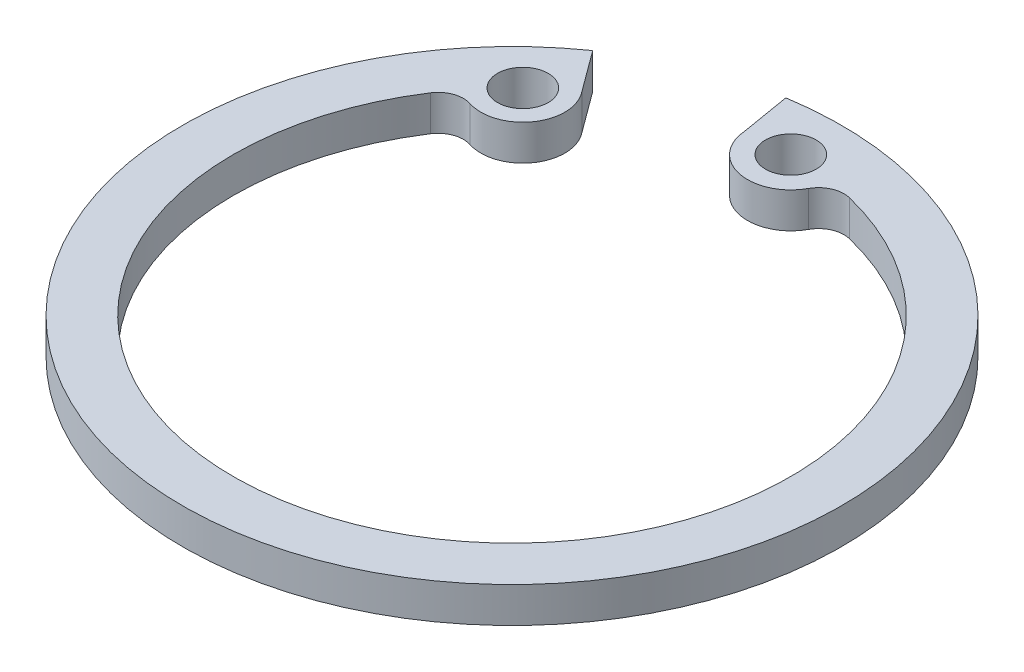
ISO-10303-21;
HEADER;
FILE_DESCRIPTION(('STEP AP214'),'2;1');
FILE_NAME('part.step','',(''),(''),'','','');
FILE_SCHEMA(('AUTOMOTIVE_DESIGN { 1 0 10303 214 1 1 1 1 }'));
ENDSEC;
DATA;
#1=APPLICATION_CONTEXT('core data for automotive mechanical design processes');
#2=APPLICATION_PROTOCOL_DEFINITION('international standard','automotive_design',2000,#1);
#3=PRODUCT_CONTEXT('',#1,'mechanical');
#4=PRODUCT('Part','Part','',(#3));
#5=PRODUCT_RELATED_PRODUCT_CATEGORY('part','',(#4));
#6=PRODUCT_DEFINITION_FORMATION('','',#4);
#7=PRODUCT_DEFINITION_CONTEXT('part definition',#1,'design');
#8=PRODUCT_DEFINITION('design','',#6,#7);
#9=PRODUCT_DEFINITION_SHAPE('','',#8);
#10=(LENGTH_UNIT() NAMED_UNIT(*) SI_UNIT(.MILLI.,.METRE.));
#11=(NAMED_UNIT(*) PLANE_ANGLE_UNIT() SI_UNIT($,.RADIAN.));
#12=(NAMED_UNIT(*) SI_UNIT($,.STERADIAN.) SOLID_ANGLE_UNIT());
#13=UNCERTAINTY_MEASURE_WITH_UNIT(LENGTH_MEASURE(1.E-05),#10,'distance_accuracy_value','');
#14=(GEOMETRIC_REPRESENTATION_CONTEXT(3) GLOBAL_UNCERTAINTY_ASSIGNED_CONTEXT((#13)) GLOBAL_UNIT_ASSIGNED_CONTEXT((#10,
#11,#12)) REPRESENTATION_CONTEXT('',''));
#15=CARTESIAN_POINT('',(0.,0.,0.));
#16=DIRECTION('',(0.,0.,1.));
#17=DIRECTION('',(1.,0.,0.));
#18=AXIS2_PLACEMENT_3D('',#15,#16,#17);
#19=CARTESIAN_POINT('',(-7.56112480942902,1.4,-7.9893298602722));
#20=DIRECTION('',(0.,1.,0.));
#21=DIRECTION('',(0.,0.,1.));
#22=AXIS2_PLACEMENT_3D('',#19,#20,#21);
#23=PLANE('',#22);
#24=CARTESIAN_POINT('',(0.,1.4,-11.));
#25=DIRECTION('',(0.,1.,0.));
#26=DIRECTION('',(0.,0.,1.));
#27=AXIS2_PLACEMENT_3D('',#24,#25,#26);
#28=CIRCLE('',#27,1.);
#29=CARTESIAN_POINT('',(0.,1.4,-10.));
#30=VERTEX_POINT('',#29);
#31=EDGE_CURVE('E133',#30,#30,#28,.T.);
#32=ORIENTED_EDGE('',*,*,#31,.F.);
#33=EDGE_LOOP('',(#32));
#34=FACE_BOUND('',#33,.T.);
#35=CARTESIAN_POINT('',(-7.56112480942902,1.4,-7.9893298602722));
#36=DIRECTION('',(0.,1.,0.));
#37=DIRECTION('',(0.,0.,1.));
#38=AXIS2_PLACEMENT_3D('',#35,#36,#37);
#39=CIRCLE('',#38,1.65691523834354);
#40=CARTESIAN_POINT('',(-8.0700995983329,1.4,-6.41252525242908));
#41=VERTEX_POINT('',#40);
#42=CARTESIAN_POINT('',(-6.27534352941445,1.4,-9.03438230250614));
#43=VERTEX_POINT('',#42);
#44=EDGE_CURVE('E144',#41,#43,#39,.T.);
#45=ORIENTED_EDGE('',*,*,#44,.T.);
#46=DIRECTION('',(-0.592679866235724,0.,-0.805438126834585));
#47=VECTOR('',#46,1.);
#48=CARTESIAN_POINT('',(-6.27534352941445,1.4,-9.03438230250614));
#49=LINE('',#48,#47);
#50=CARTESIAN_POINT('',(-7.4610766928894,1.4,-10.6457660402069));
#51=VERTEX_POINT('',#50);
#52=EDGE_CURVE('E92',#43,#51,#49,.T.);
#53=ORIENTED_EDGE('',*,*,#52,.T.);
#54=CARTESIAN_POINT('',(0.,1.4,0.));
#55=DIRECTION('',(0.,1.,0.));
#56=DIRECTION('',(0.,0.,1.));
#57=AXIS2_PLACEMENT_3D('',#54,#55,#56);
#58=CIRCLE('',#57,13.);
#59=CARTESIAN_POINT('',(-2.03684759198076,1.4,-12.839441260703));
#60=VERTEX_POINT('',#59);
#61=EDGE_CURVE('E159',#51,#60,#58,.T.);
#62=ORIENTED_EDGE('',*,*,#61,.T.);
#63=DIRECTION('',(0.166071808847117,0.,0.986113661961057));
#64=VECTOR('',#63,1.);
#65=CARTESIAN_POINT('',(-1.70468620063874,1.4,-10.8671083990799));
#66=LINE('',#65,#64);
#67=CARTESIAN_POINT('',(-1.70468620063874,1.4,-10.8671083990799));
#68=VERTEX_POINT('',#67);
#69=EDGE_CURVE('E172',#60,#68,#66,.T.);
#70=ORIENTED_EDGE('',*,*,#69,.T.);
#71=CARTESIAN_POINT('',(0.,1.4,-11.));
#72=DIRECTION('',(0.,1.,0.));
#73=DIRECTION('',(0.,0.,1.));
#74=AXIS2_PLACEMENT_3D('',#71,#72,#73);
#75=CIRCLE('',#74,1.70985824565759);
#76=CARTESIAN_POINT('',(1.50425886191016,1.4,-10.1870913356299));
#77=VERTEX_POINT('',#76);
#78=EDGE_CURVE('E111',#68,#77,#75,.T.);
#79=ORIENTED_EDGE('',*,*,#78,.T.);
#80=CARTESIAN_POINT('',(2.38401533630236,1.4,-9.71166674038371));
#81=DIRECTION('',(0.,-1.,0.));
#82=DIRECTION('',(0.,0.,1.));
#83=AXIS2_PLACEMENT_3D('',#80,#81,#82);
#84=CIRCLE('',#83,1.);
#85=CARTESIAN_POINT('',(2.6224168699326,1.4,-10.6828334144221));
#86=VERTEX_POINT('',#85);
#87=EDGE_CURVE('E105',#77,#86,#84,.T.);
#88=ORIENTED_EDGE('',*,*,#87,.T.);
#89=CARTESIAN_POINT('',(0.,1.4,0.));
#90=DIRECTION('',(0.,-1.,0.));
#91=DIRECTION('',(0.,0.,1.));
#92=AXIS2_PLACEMENT_3D('',#89,#90,#91);
#93=CIRCLE('',#92,11.);
#94=CARTESIAN_POINT('',(-9.2150099255706,1.4,-6.00696196688769));
#95=VERTEX_POINT('',#94);
#96=EDGE_CURVE('E109',#86,#95,#93,.T.);
#97=ORIENTED_EDGE('',*,*,#96,.T.);
#98=CARTESIAN_POINT('',(-8.37728175051873,1.4,-5.46087451535245));
#99=DIRECTION('',(0.,-1.,0.));
#100=DIRECTION('',(0.,0.,1.));
#101=AXIS2_PLACEMENT_3D('',#98,#99,#100);
#102=CIRCLE('',#101,1.);
#103=EDGE_CURVE('E49',#95,#41,#102,.T.);
#104=ORIENTED_EDGE('',*,*,#103,.T.);
#105=EDGE_LOOP('',(#45,#53,#62,#70,#79,#88,#97,#104));
#106=FACE_BOUND('',#105,.T.);
#107=CARTESIAN_POINT('',(-7.56112480942902,1.4,-7.9893298602722));
#108=DIRECTION('',(0.,1.,0.));
#109=DIRECTION('',(0.,0.,1.));
#110=AXIS2_PLACEMENT_3D('',#107,#108,#109);
#111=CIRCLE('',#110,1.);
#112=CARTESIAN_POINT('',(-7.56112480942902,1.4,-6.9893298602722));
#113=VERTEX_POINT('',#112);
#114=EDGE_CURVE('E181',#113,#113,#111,.T.);
#115=ORIENTED_EDGE('',*,*,#114,.F.);
#116=EDGE_LOOP('',(#115));
#117=FACE_BOUND('',#116,.T.);
#118=ADVANCED_FACE('F32',(#34,#106,#117),#23,.T.);
#119=CARTESIAN_POINT('',(-7.56112480942902,0.,-7.9893298602722));
#120=DIRECTION('',(0.,1.,0.));
#121=DIRECTION('',(0.,0.,1.));
#122=AXIS2_PLACEMENT_3D('',#119,#120,#121);
#123=PLANE('',#122);
#124=CARTESIAN_POINT('',(0.,0.,-11.));
#125=DIRECTION('',(0.,1.,0.));
#126=DIRECTION('',(0.,0.,1.));
#127=AXIS2_PLACEMENT_3D('',#124,#125,#126);
#128=CIRCLE('',#127,1.);
#129=CARTESIAN_POINT('',(0.,0.,-10.));
#130=VERTEX_POINT('',#129);
#131=EDGE_CURVE('E178',#130,#130,#128,.T.);
#132=ORIENTED_EDGE('',*,*,#131,.T.);
#133=EDGE_LOOP('',(#132));
#134=FACE_BOUND('',#133,.T.);
#135=CARTESIAN_POINT('',(-7.56112480942902,0.,-7.9893298602722));
#136=DIRECTION('',(0.,1.,0.));
#137=DIRECTION('',(0.,0.,1.));
#138=AXIS2_PLACEMENT_3D('',#135,#136,#137);
#139=CIRCLE('',#138,1.65691523834354);
#140=CARTESIAN_POINT('',(-8.0700995983329,0.,-6.41252525242908));
#141=VERTEX_POINT('',#140);
#142=CARTESIAN_POINT('',(-6.27534352941445,0.,-9.03438230250614));
#143=VERTEX_POINT('',#142);
#144=EDGE_CURVE('E129',#141,#143,#139,.T.);
#145=ORIENTED_EDGE('',*,*,#144,.F.);
#146=CARTESIAN_POINT('',(-8.37728175051873,0.,-5.46087451535245));
#147=DIRECTION('',(0.,-1.,0.));
#148=DIRECTION('',(0.,0.,1.));
#149=AXIS2_PLACEMENT_3D('',#146,#147,#148);
#150=CIRCLE('',#149,1.);
#151=CARTESIAN_POINT('',(-9.2150099255706,0.,-6.00696196688769));
#152=VERTEX_POINT('',#151);
#153=EDGE_CURVE('E84',#152,#141,#150,.T.);
#154=ORIENTED_EDGE('',*,*,#153,.F.);
#155=CARTESIAN_POINT('',(0.,0.,0.));
#156=DIRECTION('',(0.,-1.,0.));
#157=DIRECTION('',(0.,0.,1.));
#158=AXIS2_PLACEMENT_3D('',#155,#156,#157);
#159=CIRCLE('',#158,11.);
#160=CARTESIAN_POINT('',(2.6224168699326,0.,-10.6828334144221));
#161=VERTEX_POINT('',#160);
#162=EDGE_CURVE('E78',#161,#152,#159,.T.);
#163=ORIENTED_EDGE('',*,*,#162,.F.);
#164=CARTESIAN_POINT('',(2.38401533630236,0.,-9.71166674038371));
#165=DIRECTION('',(0.,-1.,0.));
#166=DIRECTION('',(0.,0.,1.));
#167=AXIS2_PLACEMENT_3D('',#164,#165,#166);
#168=CIRCLE('',#167,1.);
#169=CARTESIAN_POINT('',(1.50425886191016,0.,-10.1870913356299));
#170=VERTEX_POINT('',#169);
#171=EDGE_CURVE('E119',#170,#161,#168,.T.);
#172=ORIENTED_EDGE('',*,*,#171,.F.);
#173=CARTESIAN_POINT('',(0.,0.,-11.));
#174=DIRECTION('',(0.,1.,0.));
#175=DIRECTION('',(0.,0.,1.));
#176=AXIS2_PLACEMENT_3D('',#173,#174,#175);
#177=CIRCLE('',#176,1.70985824565759);
#178=CARTESIAN_POINT('',(-1.70468620063874,0.,-10.8671083990799));
#179=VERTEX_POINT('',#178);
#180=EDGE_CURVE('E139',#179,#170,#177,.T.);
#181=ORIENTED_EDGE('',*,*,#180,.F.);
#182=DIRECTION('',(0.166071808847117,0.,0.986113661961057));
#183=VECTOR('',#182,1.);
#184=CARTESIAN_POINT('',(-1.70468620063874,0.,-10.8671083990799));
#185=LINE('',#184,#183);
#186=CARTESIAN_POINT('',(-2.03684759198076,0.,-12.839441260703));
#187=VERTEX_POINT('',#186);
#188=EDGE_CURVE('E137',#187,#179,#185,.T.);
#189=ORIENTED_EDGE('',*,*,#188,.F.);
#190=CARTESIAN_POINT('',(0.,0.,0.));
#191=DIRECTION('',(0.,1.,0.));
#192=DIRECTION('',(0.,0.,1.));
#193=AXIS2_PLACEMENT_3D('',#190,#191,#192);
#194=CIRCLE('',#193,13.);
#195=CARTESIAN_POINT('',(-7.4610766928894,0.,-10.6457660402069));
#196=VERTEX_POINT('',#195);
#197=EDGE_CURVE('E135',#196,#187,#194,.T.);
#198=ORIENTED_EDGE('',*,*,#197,.F.);
#199=DIRECTION('',(-0.592679866235724,0.,-0.805438126834585));
#200=VECTOR('',#199,1.);
#201=CARTESIAN_POINT('',(-6.27534352941445,0.,-9.03438230250614));
#202=LINE('',#201,#200);
#203=EDGE_CURVE('E132',#143,#196,#202,.T.);
#204=ORIENTED_EDGE('',*,*,#203,.F.);
#205=EDGE_LOOP('',(#145,#154,#163,#172,#181,#189,#198,#204));
#206=FACE_BOUND('',#205,.T.);
#207=CARTESIAN_POINT('',(-7.56112480942902,0.,-7.9893298602722));
#208=DIRECTION('',(0.,1.,0.));
#209=DIRECTION('',(0.,0.,1.));
#210=AXIS2_PLACEMENT_3D('',#207,#208,#209);
#211=CIRCLE('',#210,1.);
#212=CARTESIAN_POINT('',(-7.56112480942902,0.,-6.9893298602722));
#213=VERTEX_POINT('',#212);
#214=EDGE_CURVE('E184',#213,#213,#211,.T.);
#215=ORIENTED_EDGE('',*,*,#214,.T.);
#216=EDGE_LOOP('',(#215));
#217=FACE_BOUND('',#216,.T.);
#218=ADVANCED_FACE('F163',(#134,#206,#217),#123,.F.);
#219=CARTESIAN_POINT('',(-7.56112480942902,1.4,-7.9893298602722));
#220=DIRECTION('',(0.,-1.,0.));
#221=DIRECTION('',(0.,0.,-1.));
#222=AXIS2_PLACEMENT_3D('',#219,#220,#221);
#223=CYLINDRICAL_SURFACE('',#222,1.65691523834354);
#224=ORIENTED_EDGE('',*,*,#144,.T.);
#225=DIRECTION('',(0.,-1.,0.));
#226=VECTOR('',#225,1.);
#227=CARTESIAN_POINT('',(-6.27534352941445,1.4,-9.03438230250614));
#228=LINE('',#227,#226);
#229=EDGE_CURVE('E11',#43,#143,#228,.T.);
#230=ORIENTED_EDGE('',*,*,#229,.F.);
#231=ORIENTED_EDGE('',*,*,#44,.F.);
#232=DIRECTION('',(0.,-1.,0.));
#233=VECTOR('',#232,1.);
#234=CARTESIAN_POINT('',(-8.0700995983329,1.4,-6.41252525242908));
#235=LINE('',#234,#233);
#236=EDGE_CURVE('E125',#41,#141,#235,.T.);
#237=ORIENTED_EDGE('',*,*,#236,.T.);
#238=EDGE_LOOP('',(#224,#230,#231,#237));
#239=FACE_BOUND('',#238,.T.);
#240=ADVANCED_FACE('F34',(#239),#223,.T.);
#241=CARTESIAN_POINT('',(-6.27534352941445,1.4,-9.03438230250614));
#242=DIRECTION('',(-0.805438126834585,0.,0.592679866235724));
#243=DIRECTION('',(0.592679866235724,0.,0.805438126834585));
#244=AXIS2_PLACEMENT_3D('',#241,#242,#243);
#245=PLANE('',#244);
#246=ORIENTED_EDGE('',*,*,#203,.T.);
#247=DIRECTION('',(0.,-1.,0.));
#248=VECTOR('',#247,1.);
#249=CARTESIAN_POINT('',(-7.4610766928894,1.4,-10.6457660402069));
#250=LINE('',#249,#248);
#251=EDGE_CURVE('E41',#51,#196,#250,.T.);
#252=ORIENTED_EDGE('',*,*,#251,.F.);
#253=ORIENTED_EDGE('',*,*,#52,.F.);
#254=ORIENTED_EDGE('',*,*,#229,.T.);
#255=EDGE_LOOP('',(#246,#252,#253,#254));
#256=FACE_BOUND('',#255,.T.);
#257=ADVANCED_FACE('F217',(#256),#245,.F.);
#258=CARTESIAN_POINT('',(0.,1.4,0.));
#259=DIRECTION('',(0.,-1.,0.));
#260=DIRECTION('',(0.,0.,-1.));
#261=AXIS2_PLACEMENT_3D('',#258,#259,#260);
#262=CYLINDRICAL_SURFACE('',#261,13.);
#263=ORIENTED_EDGE('',*,*,#197,.T.);
#264=DIRECTION('',(0.,-1.,0.));
#265=VECTOR('',#264,1.);
#266=CARTESIAN_POINT('',(-2.03684759198076,1.4,-12.839441260703));
#267=LINE('',#266,#265);
#268=EDGE_CURVE('E151',#60,#187,#267,.T.);
#269=ORIENTED_EDGE('',*,*,#268,.F.);
#270=ORIENTED_EDGE('',*,*,#61,.F.);
#271=ORIENTED_EDGE('',*,*,#251,.T.);
#272=EDGE_LOOP('',(#263,#269,#270,#271));
#273=FACE_BOUND('',#272,.T.);
#274=ADVANCED_FACE('F157',(#273),#262,.T.);
#275=CARTESIAN_POINT('',(-1.70468620063874,1.4,-10.8671083990799));
#276=DIRECTION('',(0.986113661961057,0.,-0.166071808847117));
#277=DIRECTION('',(-0.166071808847117,0.,-0.986113661961057));
#278=AXIS2_PLACEMENT_3D('',#275,#276,#277);
#279=PLANE('',#278);
#280=ORIENTED_EDGE('',*,*,#188,.T.);
#281=DIRECTION('',(0.,-1.,0.));
#282=VECTOR('',#281,1.);
#283=CARTESIAN_POINT('',(-1.70468620063874,1.4,-10.8671083990799));
#284=LINE('',#283,#282);
#285=EDGE_CURVE('E148',#68,#179,#284,.T.);
#286=ORIENTED_EDGE('',*,*,#285,.F.);
#287=ORIENTED_EDGE('',*,*,#69,.F.);
#288=ORIENTED_EDGE('',*,*,#268,.T.);
#289=EDGE_LOOP('',(#280,#286,#287,#288));
#290=FACE_BOUND('',#289,.T.);
#291=ADVANCED_FACE('F168',(#290),#279,.F.);
#292=CARTESIAN_POINT('',(0.,1.4,-11.));
#293=DIRECTION('',(0.,-1.,0.));
#294=DIRECTION('',(0.,0.,-1.));
#295=AXIS2_PLACEMENT_3D('',#292,#293,#294);
#296=CYLINDRICAL_SURFACE('',#295,1.70985824565759);
#297=ORIENTED_EDGE('',*,*,#180,.T.);
#298=DIRECTION('',(0.,-1.,0.));
#299=VECTOR('',#298,1.);
#300=CARTESIAN_POINT('',(1.50425886191016,1.4,-10.1870913356299));
#301=LINE('',#300,#299);
#302=EDGE_CURVE('E120',#77,#170,#301,.T.);
#303=ORIENTED_EDGE('',*,*,#302,.F.);
#304=ORIENTED_EDGE('',*,*,#78,.F.);
#305=ORIENTED_EDGE('',*,*,#285,.T.);
#306=EDGE_LOOP('',(#297,#303,#304,#305));
#307=FACE_BOUND('',#306,.T.);
#308=ADVANCED_FACE('F171',(#307),#296,.T.);
#309=CARTESIAN_POINT('',(2.38401533630236,1.4,-9.71166674038371));
#310=DIRECTION('',(0.,-1.,0.));
#311=DIRECTION('',(0.,0.,-1.));
#312=AXIS2_PLACEMENT_3D('',#309,#310,#311);
#313=CYLINDRICAL_SURFACE('',#312,1.);
#314=ORIENTED_EDGE('',*,*,#171,.T.);
#315=DIRECTION('',(0.,-1.,0.));
#316=VECTOR('',#315,1.);
#317=CARTESIAN_POINT('',(2.6224168699326,1.4,-10.6828334144221));
#318=LINE('',#317,#316);
#319=EDGE_CURVE('E116',#86,#161,#318,.T.);
#320=ORIENTED_EDGE('',*,*,#319,.F.);
#321=ORIENTED_EDGE('',*,*,#87,.F.);
#322=ORIENTED_EDGE('',*,*,#302,.T.);
#323=EDGE_LOOP('',(#314,#320,#321,#322));
#324=FACE_BOUND('',#323,.T.);
#325=ADVANCED_FACE('F117',(#324),#313,.F.);
#326=CARTESIAN_POINT('',(0.,1.4,0.));
#327=DIRECTION('',(0.,-1.,0.));
#328=DIRECTION('',(0.,0.,-1.));
#329=AXIS2_PLACEMENT_3D('',#326,#327,#328);
#330=CYLINDRICAL_SURFACE('',#329,11.);
#331=ORIENTED_EDGE('',*,*,#162,.T.);
#332=DIRECTION('',(0.,-1.,0.));
#333=VECTOR('',#332,1.);
#334=CARTESIAN_POINT('',(-9.2150099255706,1.4,-6.00696196688769));
#335=LINE('',#334,#333);
#336=EDGE_CURVE('E121',#95,#152,#335,.T.);
#337=ORIENTED_EDGE('',*,*,#336,.F.);
#338=ORIENTED_EDGE('',*,*,#96,.F.);
#339=ORIENTED_EDGE('',*,*,#319,.T.);
#340=EDGE_LOOP('',(#331,#337,#338,#339));
#341=FACE_BOUND('',#340,.T.);
#342=ADVANCED_FACE('F123',(#341),#330,.F.);
#343=CARTESIAN_POINT('',(-8.37728175051873,1.4,-5.46087451535245));
#344=DIRECTION('',(0.,-1.,0.));
#345=DIRECTION('',(0.,0.,-1.));
#346=AXIS2_PLACEMENT_3D('',#343,#344,#345);
#347=CYLINDRICAL_SURFACE('',#346,1.);
#348=ORIENTED_EDGE('',*,*,#153,.T.);
#349=ORIENTED_EDGE('',*,*,#236,.F.);
#350=ORIENTED_EDGE('',*,*,#103,.F.);
#351=ORIENTED_EDGE('',*,*,#336,.T.);
#352=EDGE_LOOP('',(#348,#349,#350,#351));
#353=FACE_BOUND('',#352,.T.);
#354=ADVANCED_FACE('F205',(#353),#347,.F.);
#355=CARTESIAN_POINT('',(0.,1.4,-11.));
#356=DIRECTION('',(0.,-1.,0.));
#357=DIRECTION('',(0.,0.,-1.));
#358=AXIS2_PLACEMENT_3D('',#355,#356,#357);
#359=CYLINDRICAL_SURFACE('',#358,1.);
#360=ORIENTED_EDGE('',*,*,#31,.T.);
#361=EDGE_LOOP('',(#360));
#362=FACE_BOUND('',#361,.T.);
#363=ORIENTED_EDGE('',*,*,#131,.F.);
#364=EDGE_LOOP('',(#363));
#365=FACE_BOUND('',#364,.T.);
#366=ADVANCED_FACE('F202',(#362,#365),#359,.F.);
#367=CARTESIAN_POINT('',(-7.56112480942902,1.4,-7.9893298602722));
#368=DIRECTION('',(0.,-1.,0.));
#369=DIRECTION('',(0.,0.,-1.));
#370=AXIS2_PLACEMENT_3D('',#367,#368,#369);
#371=CYLINDRICAL_SURFACE('',#370,1.);
#372=ORIENTED_EDGE('',*,*,#114,.T.);
#373=EDGE_LOOP('',(#372));
#374=FACE_BOUND('',#373,.T.);
#375=ORIENTED_EDGE('',*,*,#214,.F.);
#376=EDGE_LOOP('',(#375));
#377=FACE_BOUND('',#376,.T.);
#378=ADVANCED_FACE('F190',(#374,#377),#371,.F.);
#379=CLOSED_SHELL('',(#118,#218,#240,#257,#274,#291,#308,#325,#342,#354,#366,#378));
#380=MANIFOLD_SOLID_BREP('B2',#379);
#381=ADVANCED_BREP_SHAPE_REPRESENTATION('',(#18,#380),#14);
#382=SHAPE_DEFINITION_REPRESENTATION(#9,#381);
ENDSEC;
END-ISO-10303-21;
